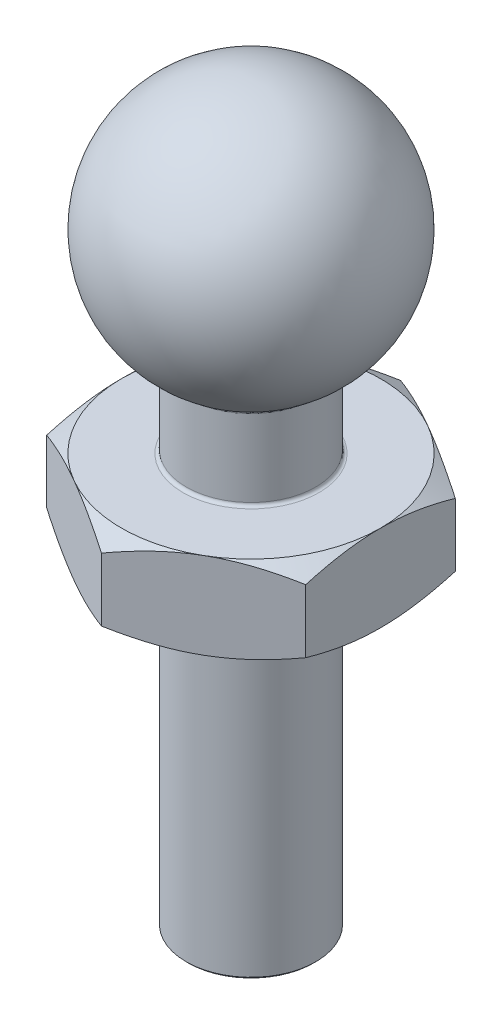
ISO-10303-21;
HEADER;
FILE_DESCRIPTION(('STEP AP214'),'2;1');
FILE_NAME('part.step','',(''),(''),'','','');
FILE_SCHEMA(('AUTOMOTIVE_DESIGN { 1 0 10303 214 1 1 1 1 }'));
ENDSEC;
DATA;
#1=APPLICATION_CONTEXT('core data for automotive mechanical design processes');
#2=APPLICATION_PROTOCOL_DEFINITION('international standard','automotive_design',2000,#1);
#3=PRODUCT_CONTEXT('',#1,'mechanical');
#4=PRODUCT('Part','Part','',(#3));
#5=PRODUCT_RELATED_PRODUCT_CATEGORY('part','',(#4));
#6=PRODUCT_DEFINITION_FORMATION('','',#4);
#7=PRODUCT_DEFINITION_CONTEXT('part definition',#1,'design');
#8=PRODUCT_DEFINITION('design','',#6,#7);
#9=PRODUCT_DEFINITION_SHAPE('','',#8);
#10=(LENGTH_UNIT() NAMED_UNIT(*) SI_UNIT(.MILLI.,.METRE.));
#11=(NAMED_UNIT(*) PLANE_ANGLE_UNIT() SI_UNIT($,.RADIAN.));
#12=(NAMED_UNIT(*) SI_UNIT($,.STERADIAN.) SOLID_ANGLE_UNIT());
#13=UNCERTAINTY_MEASURE_WITH_UNIT(LENGTH_MEASURE(1.E-05),#10,'distance_accuracy_value','');
#14=(GEOMETRIC_REPRESENTATION_CONTEXT(3) GLOBAL_UNCERTAINTY_ASSIGNED_CONTEXT((#13)) GLOBAL_UNIT_ASSIGNED_CONTEXT((#10,
#11,#12)) REPRESENTATION_CONTEXT('',''));
#15=CARTESIAN_POINT('',(0.,0.,0.));
#16=DIRECTION('',(0.,0.,1.));
#17=DIRECTION('',(1.,0.,0.));
#18=AXIS2_PLACEMENT_3D('',#15,#16,#17);
#19=CARTESIAN_POINT('',(-3.,9.5,-1.73205080756888));
#20=DIRECTION('',(1.,0.,0.));
#21=DIRECTION('',(0.,0.,-1.));
#22=AXIS2_PLACEMENT_3D('',#19,#20,#21);
#23=PLANE('',#22);
#24=CARTESIAN_POINT('',(-3.,7.49669275597267,-5.73225080756888));
#25=CARTESIAN_POINT('',(-3.,7.56535762873894,-5.59799811373669));
#26=CARTESIAN_POINT('',(-3.,7.63362658074956,-5.46354106552017));
#27=CARTESIAN_POINT('',(-3.,7.7691751977503,-5.19412594711895));
#28=CARTESIAN_POINT('',(-3.,7.83645484167597,-5.05916786634262));
#29=CARTESIAN_POINT('',(-3.,7.96993872408742,-4.78843231789163));
#30=CARTESIAN_POINT('',(-3.,8.0361409223391,-4.65265384244874));
#31=CARTESIAN_POINT('',(-3.,8.16708055525372,-4.38038885038151));
#32=CARTESIAN_POINT('',(-3.,8.23181796851999,-4.24390232345014));
#33=CARTESIAN_POINT('',(-3.,8.36273075239076,-3.96310511366176));
#34=CARTESIAN_POINT('',(-3.,8.42881132731156,-3.81875010473635));
#35=CARTESIAN_POINT('',(-3.,8.55842928727965,-3.52890389215656));
#36=CARTESIAN_POINT('',(-3.,8.62196674541402,-3.38341272129836));
#37=CARTESIAN_POINT('',(-3.,8.74573518476893,-3.0911428032025));
#38=CARTESIAN_POINT('',(-3.,8.80596844827942,-2.94436502804428));
#39=CARTESIAN_POINT('',(-3.,8.92221294586851,-2.64909731827644));
#40=CARTESIAN_POINT('',(-3.,8.97822314680859,-2.50060697487877));
#41=CARTESIAN_POINT('',(-3.,9.09420348606466,-2.17495473766773));
#42=CARTESIAN_POINT('',(-3.,9.15309774811247,-1.99740334689548));
#43=CARTESIAN_POINT('',(-3.,9.26029523419006,-1.63917764376158));
#44=CARTESIAN_POINT('',(-3.,9.30860404614459,-1.45850503366086));
#45=CARTESIAN_POINT('',(-3.,9.39023263279609,-1.09720914532956));
#46=CARTESIAN_POINT('',(-3.,9.42381477693698,-0.916647599895753));
#47=CARTESIAN_POINT('',(-3.,9.46126742176692,-0.644079261802783));
#48=CARTESIAN_POINT('',(-3.,9.47159787377878,-0.55294342286709));
#49=CARTESIAN_POINT('',(-3.,9.48763454600052,-0.370270654947723));
#50=CARTESIAN_POINT('',(-3.,9.49334144079801,-0.278733786435305));
#51=CARTESIAN_POINT('',(-3.,9.49996614854262,-0.0944078517722047));
#52=CARTESIAN_POINT('',(-3.,9.5008268616344,-0.00161671746075645));
#53=CARTESIAN_POINT('',(-3.,9.49757525562797,0.183877598413804));
#54=CARTESIAN_POINT('',(-3.,9.49346292019229,0.276580779686972));
#55=CARTESIAN_POINT('',(-3.,9.48041370767168,0.461668088480518));
#56=CARTESIAN_POINT('',(-3.,9.47147558711607,0.554052127589446));
#57=CARTESIAN_POINT('',(-3.,9.4490819835307,0.738276464049777));
#58=CARTESIAN_POINT('',(-3.,9.43562578745625,0.830116673244046));
#59=CARTESIAN_POINT('',(-3.,9.38848678345653,1.1081241349506));
#60=CARTESIAN_POINT('',(-3.,9.34831083516922,1.2932028927465));
#61=CARTESIAN_POINT('',(-3.,9.25483304091392,1.65992833453579));
#62=CARTESIAN_POINT('',(-3.,9.2015281748169,1.8415742184766));
#63=CARTESIAN_POINT('',(-3.,9.09001482170302,2.18718321983853));
#64=CARTESIAN_POINT('',(-3.,9.03254960886738,2.35139002090274));
#65=CARTESIAN_POINT('',(-3.,8.91157770593576,2.67757637701536));
#66=CARTESIAN_POINT('',(-3.,8.84806982210383,2.83955548471668));
#67=CARTESIAN_POINT('',(-3.,8.71649668995848,3.16180541641892));
#68=CARTESIAN_POINT('',(-3.,8.64842746398322,3.32207460435457));
#69=CARTESIAN_POINT('',(-3.,8.50888164672136,3.64112437712565));
#70=CARTESIAN_POINT('',(-3.,8.43740489080743,3.79990488959462));
#71=CARTESIAN_POINT('',(-3.,8.29572041514807,4.10783154121877));
#72=CARTESIAN_POINT('',(-3.,8.22564804300012,4.25704019529893));
#73=CARTESIAN_POINT('',(-3.,8.0836551872923,4.55457880885657));
#74=CARTESIAN_POINT('',(-3.,8.01173465191385,4.70290874355283));
#75=CARTESIAN_POINT('',(-3.,7.86663085724281,4.99841900754648));
#76=CARTESIAN_POINT('',(-3.,7.79345182235509,5.14560141584992));
#77=CARTESIAN_POINT('',(-3.,7.64590152942626,5.43935321353677));
#78=CARTESIAN_POINT('',(-3.,7.57153036655204,5.58592265068707));
#79=CARTESIAN_POINT('',(-3.,7.49669275597267,5.73225080756888));
#80=B_SPLINE_CURVE_WITH_KNOTS('',3,(#24,#25,#26,#27,#28,#29,#30,#31,#32,#33,#34,#35,#36,#37,#38,
#39,#40,#41,#42,#43,#44,#45,#46,#47,#48,#49,#50,#51,#52,#53,#54,#55,#56,#57,#58,#59,#60,#61,#62,
#63,#64,#65,#66,#67,#68,#69,#70,#71,#72,#73,#74,#75,#76,#77,#78,#79),.UNSPECIFIED.,.F.,.F.,(4,2,
2,2,2,2,2,2,2,2,2,2,2,2,2,2,2,2,2,2,2,2,2,2,2,2,2,4),(0.,0.452382016001321,0.904773650265348,
1.35794045354517,1.81111387213612,2.2873771437625,2.76362671813267,3.23954308217786,
3.71557550010852,4.27652369616462,4.83717505756687,5.38738613645125,5.66244417939779,
5.937462083513,6.21571369559986,6.4939662218021,6.77229048018743,7.05065868449287,
7.61810965270507,8.18569127741243,8.70745206667821,9.2293161451901,9.75164138486645,
10.2739918851653,10.7685068932809,11.2630357817083,11.756143015984,12.2492110799155),.UNSPECIFIED.);
#81=CARTESIAN_POINT('',(-3.,9.23205080756888,-1.73205080756888));
#82=VERTEX_POINT('',#81);
#83=CARTESIAN_POINT('',(-3.,9.5,0.));
#84=VERTEX_POINT('',#83);
#85=EDGE_CURVE('E231',#82,#84,#80,.T.);
#86=ORIENTED_EDGE('',*,*,#85,.F.);
#87=DIRECTION('',(0.,-1.,0.));
#88=VECTOR('',#87,1.);
#89=CARTESIAN_POINT('',(-3.,9.5,-1.73205080756888));
#90=LINE('',#89,#88);
#91=CARTESIAN_POINT('',(-3.,7.7679491924311,-1.73205080756891));
#92=VERTEX_POINT('',#91);
#93=EDGE_CURVE('E177',#82,#92,#90,.T.);
#94=ORIENTED_EDGE('',*,*,#93,.T.);
#95=CARTESIAN_POINT('',(-3.,9.50330724402733,5.73225080756888));
#96=CARTESIAN_POINT('',(-3.,9.43464237126105,5.59799811373669));
#97=CARTESIAN_POINT('',(-3.,9.36637341925044,5.46354106552017));
#98=CARTESIAN_POINT('',(-3.,9.2308248022497,5.19412594711896));
#99=CARTESIAN_POINT('',(-3.,9.16354515832403,5.05916786634262));
#100=CARTESIAN_POINT('',(-3.,9.03006127591258,4.78843231789163));
#101=CARTESIAN_POINT('',(-3.,8.9638590776609,4.65265384244875));
#102=CARTESIAN_POINT('',(-3.,8.83291944474628,4.38038885038151));
#103=CARTESIAN_POINT('',(-3.,8.76818203148001,4.24390232345014));
#104=CARTESIAN_POINT('',(-3.,8.63726924760924,3.96310511366176));
#105=CARTESIAN_POINT('',(-3.,8.57118867268844,3.81875010473635));
#106=CARTESIAN_POINT('',(-3.,8.44157071272035,3.52890389215656));
#107=CARTESIAN_POINT('',(-3.,8.37803325458598,3.38341272129836));
#108=CARTESIAN_POINT('',(-3.,8.25426481523107,3.0911428032025));
#109=CARTESIAN_POINT('',(-3.,8.19403155172058,2.94436502804428));
#110=CARTESIAN_POINT('',(-3.,8.07778705413149,2.64909731827644));
#111=CARTESIAN_POINT('',(-3.,8.02177685319141,2.50060697487877));
#112=CARTESIAN_POINT('',(-3.,7.90579651393534,2.17495473766773));
#113=CARTESIAN_POINT('',(-3.,7.84690225188754,1.99740334689548));
#114=CARTESIAN_POINT('',(-3.,7.73970476580994,1.63917764376158));
#115=CARTESIAN_POINT('',(-3.,7.69139595385541,1.45850503366086));
#116=CARTESIAN_POINT('',(-3.,7.60976736720391,1.09720914532956));
#117=CARTESIAN_POINT('',(-3.,7.57618522306301,0.916647599895755));
#118=CARTESIAN_POINT('',(-3.,7.53873257823308,0.644079261802784));
#119=CARTESIAN_POINT('',(-3.,7.52840212622122,0.552943422867091));
#120=CARTESIAN_POINT('',(-3.,7.51236545399948,0.370270654947725));
#121=CARTESIAN_POINT('',(-3.,7.50665855920199,0.278733786435306));
#122=CARTESIAN_POINT('',(-3.,7.50003385145738,0.094407851772205));
#123=CARTESIAN_POINT('',(-3.,7.4991731383656,0.00161671746075656));
#124=CARTESIAN_POINT('',(-3.,7.50242474437203,-0.183877598413804));
#125=CARTESIAN_POINT('',(-3.,7.50653707980771,-0.276580779686972));
#126=CARTESIAN_POINT('',(-3.,7.51958629232832,-0.461668088480519));
#127=CARTESIAN_POINT('',(-3.,7.52852441288393,-0.554052127589447));
#128=CARTESIAN_POINT('',(-3.,7.55091801646931,-0.738276464049778));
#129=CARTESIAN_POINT('',(-3.,7.56437421254375,-0.830116673244047));
#130=CARTESIAN_POINT('',(-3.,7.61151321654347,-1.1081241349506));
#131=CARTESIAN_POINT('',(-3.,7.65168916483078,-1.2932028927465));
#132=CARTESIAN_POINT('',(-3.,7.74516695908608,-1.65992833453579));
#133=CARTESIAN_POINT('',(-3.,7.79847182518309,-1.84157421847661));
#134=CARTESIAN_POINT('',(-3.,7.90998517829698,-2.18718321983853));
#135=CARTESIAN_POINT('',(-3.,7.96745039113262,-2.35139002090274));
#136=CARTESIAN_POINT('',(-3.,8.08842229406424,-2.67757637701536));
#137=CARTESIAN_POINT('',(-3.,8.15193017789617,-2.83955548471668));
#138=CARTESIAN_POINT('',(-3.,8.28350331004152,-3.16180541641892));
#139=CARTESIAN_POINT('',(-3.,8.35157253601678,-3.32207460435457));
#140=CARTESIAN_POINT('',(-3.,8.49111835327863,-3.64112437712565));
#141=CARTESIAN_POINT('',(-3.,8.56259510919257,-3.79990488959462));
#142=CARTESIAN_POINT('',(-3.,8.70427958485193,-4.10783154121876));
#143=CARTESIAN_POINT('',(-3.,8.77435195699987,-4.25704019529893));
#144=CARTESIAN_POINT('',(-3.,8.9163448127077,-4.55457880885657));
#145=CARTESIAN_POINT('',(-3.,8.98826534808615,-4.70290874355283));
#146=CARTESIAN_POINT('',(-3.,9.13336914275719,-4.99841900754647));
#147=CARTESIAN_POINT('',(-3.,9.20654817764491,-5.14560141584992));
#148=CARTESIAN_POINT('',(-3.,9.35409847057374,-5.43935321353677));
#149=CARTESIAN_POINT('',(-3.,9.42846963344796,-5.58592265068707));
#150=CARTESIAN_POINT('',(-3.,9.50330724402733,-5.73225080756888));
#151=B_SPLINE_CURVE_WITH_KNOTS('',3,(#95,#96,#97,#98,#99,#100,#101,#102,#103,#104,#105,#106,
#107,#108,#109,#110,#111,#112,#113,#114,#115,#116,#117,#118,#119,#120,#121,#122,#123,#124,#125,
#126,#127,#128,#129,#130,#131,#132,#133,#134,#135,#136,#137,#138,#139,#140,#141,#142,#143,#144,
#145,#146,#147,#148,#149,#150),.UNSPECIFIED.,.F.,.F.,(4,2,2,2,2,2,2,2,2,2,2,2,2,2,2,2,2,2,2,2,2,
2,2,2,2,2,2,4),(0.,0.452382016001322,0.90477365026535,1.35794045354517,1.81111387213612,
2.2873771437625,2.76362671813268,3.23954308217786,3.71557550010852,4.27652369616462,
4.83717505756687,5.38738613645125,5.66244417939779,5.93746208351301,6.21571369559987,
6.4939662218021,6.77229048018743,7.05065868449288,7.61810965270508,8.18569127741244,
8.70745206667822,9.2293161451901,9.75164138486645,10.2739918851653,10.7685068932809,
11.2630357817083,11.756143015984,12.2492110799155),.UNSPECIFIED.);
#152=CARTESIAN_POINT('',(-3.,7.5,0.));
#153=VERTEX_POINT('',#152);
#154=EDGE_CURVE('E238',#153,#92,#151,.T.);
#155=ORIENTED_EDGE('',*,*,#154,.F.);
#156=CARTESIAN_POINT('',(-3.,7.76794919243112,1.73205080756888));
#157=VERTEX_POINT('',#156);
#158=EDGE_CURVE('E245',#157,#153,#151,.T.);
#159=ORIENTED_EDGE('',*,*,#158,.F.);
#160=DIRECTION('',(0.,-1.,0.));
#161=VECTOR('',#160,1.);
#162=CARTESIAN_POINT('',(-3.,9.5,1.73205080756888));
#163=LINE('',#162,#161);
#164=CARTESIAN_POINT('',(-3.,9.23205080756888,1.73205080756888));
#165=VERTEX_POINT('',#164);
#166=EDGE_CURVE('E264',#165,#157,#163,.T.);
#167=ORIENTED_EDGE('',*,*,#166,.F.);
#168=EDGE_CURVE('E162',#84,#165,#80,.T.);
#169=ORIENTED_EDGE('',*,*,#168,.F.);
#170=EDGE_LOOP('',(#86,#94,#155,#159,#167,#169));
#171=FACE_BOUND('',#170,.T.);
#172=ADVANCED_FACE('F39',(#171),#23,.F.);
#173=CARTESIAN_POINT('',(0.,9.5,-3.46410161513776));
#174=DIRECTION('',(0.5,0.,0.866025403784438));
#175=DIRECTION('',(0.866025403784438,0.,-0.5));
#176=AXIS2_PLACEMENT_3D('',#173,#174,#175);
#177=PLANE('',#176);
#178=CARTESIAN_POINT('',(0.00019999999999956,9.23198413756899,-3.46421708519159));
#179=CARTESIAN_POINT('',(-0.131635206588332,9.27594629554769,-3.38810199317915));
#180=CARTESIAN_POINT('',(-0.26460840535525,9.31592841370737,-3.31132988107606));
#181=CARTESIAN_POINT('',(-0.532857420002056,9.38571791955454,-3.15645624025988));
#182=CARTESIAN_POINT('',(-0.668138002634342,9.41550061773462,-3.078351959461));
#183=CARTESIAN_POINT('',(-0.937022602096483,9.46186216078874,-2.92311136358059));
#184=CARTESIAN_POINT('',(-1.07058524542946,9.47874955887705,-2.84599893549861));
#185=CARTESIAN_POINT('',(-1.33833905729569,9.49891035755148,-2.6914112001411));
#186=CARTESIAN_POINT('',(-1.47252925247984,9.50220045221892,-2.61393645482892));
#187=CARTESIAN_POINT('',(-1.72327559769581,9.49535946911461,-2.46916798492017));
#188=CARTESIAN_POINT('',(-1.83986926497268,9.48690808580738,-2.40185259973206));
#189=CARTESIAN_POINT('',(-2.07229698497464,9.46012105699297,-2.2676603930218));
#190=CARTESIAN_POINT('',(-2.18813023365133,9.44177625913829,-2.2007840357172));
#191=CARTESIAN_POINT('',(-2.42103725705637,9.39591524914667,-2.06631510305815));
#192=CARTESIAN_POINT('',(-2.53808155051394,9.36820461473692,-1.99873954872331));
#193=CARTESIAN_POINT('',(-2.77042435049913,9.3053122048626,-1.86459637060759));
#194=CARTESIAN_POINT('',(-2.88572583417111,9.27014520897844,-1.79802702797161));
#195=CARTESIAN_POINT('',(-3.0002,9.23198413756899,-1.73193533751504));
#196=B_SPLINE_CURVE_WITH_KNOTS('',3,(#178,#179,#180,#181,#182,#183,#184,#185,#186,#187,#188,
#189,#190,#191,#192,#193,#194,#195),.UNSPECIFIED.,.F.,.F.,(4,2,2,2,2,2,2,2,4),(0.,
0.475539830103041,0.952222784107964,1.41710776961288,1.88142182298026,2.28572436316091,
2.69040156475039,3.10405572063576,3.5168974940707),.UNSPECIFIED.);
#197=CARTESIAN_POINT('',(0.,9.23205080756888,-3.46410161513776));
#198=VERTEX_POINT('',#197);
#199=CARTESIAN_POINT('',(-1.5,9.5,-2.59807621135332));
#200=VERTEX_POINT('',#199);
#201=EDGE_CURVE('E157',#198,#200,#196,.T.);
#202=ORIENTED_EDGE('',*,*,#201,.F.);
#203=DIRECTION('',(0.,-1.,0.));
#204=VECTOR('',#203,1.);
#205=CARTESIAN_POINT('',(0.,9.5,-3.46410161513776));
#206=LINE('',#205,#204);
#207=CARTESIAN_POINT('',(0.,7.76794919243112,-3.46410161513776));
#208=VERTEX_POINT('',#207);
#209=EDGE_CURVE('E261',#198,#208,#206,.T.);
#210=ORIENTED_EDGE('',*,*,#209,.T.);
#211=CARTESIAN_POINT('',(-3.0002,7.76801586243101,-1.73193533751504));
#212=CARTESIAN_POINT('',(-2.86836479341167,7.72405370445231,-1.80805042952748));
#213=CARTESIAN_POINT('',(-2.73539159464475,7.68407158629263,-1.88482254163057));
#214=CARTESIAN_POINT('',(-2.46714257999795,7.61428208044547,-2.03969618244675));
#215=CARTESIAN_POINT('',(-2.33186199736566,7.58449938226538,-2.11780046324563));
#216=CARTESIAN_POINT('',(-2.06297739790352,7.53813783921126,-2.27304105912604));
#217=CARTESIAN_POINT('',(-1.92941475457054,7.52125044112295,-2.35015348720802));
#218=CARTESIAN_POINT('',(-1.66166094270431,7.50108964244852,-2.50474122256553));
#219=CARTESIAN_POINT('',(-1.52747074752016,7.49779954778108,-2.58221596787771));
#220=CARTESIAN_POINT('',(-1.2767244023042,7.50464053088539,-2.72698443778646));
#221=CARTESIAN_POINT('',(-1.16013073502733,7.51309191419262,-2.79429982297457));
#222=CARTESIAN_POINT('',(-0.927703015025366,7.53987894300703,-2.92849202968483));
#223=CARTESIAN_POINT('',(-0.811869766348671,7.55822374086171,-2.99536838698943));
#224=CARTESIAN_POINT('',(-0.578962742943634,7.60408475085333,-3.12983731964848));
#225=CARTESIAN_POINT('',(-0.461918449486061,7.63179538526308,-3.19741287398332));
#226=CARTESIAN_POINT('',(-0.229575649500876,7.6946877951374,-3.33155605209904));
#227=CARTESIAN_POINT('',(-0.114274165828895,7.72985479102156,-3.39812539473502));
#228=CARTESIAN_POINT('',(0.000199999999999272,7.76801586243101,-3.46421708519159));
#229=B_SPLINE_CURVE_WITH_KNOTS('',3,(#211,#212,#213,#214,#215,#216,#217,#218,#219,#220,#221,
#222,#223,#224,#225,#226,#227,#228),.UNSPECIFIED.,.F.,.F.,(4,2,2,2,2,2,2,2,4),(0.,
0.47553983010304,0.952222784107964,1.41710776961288,1.88142182298026,2.28572436316091,
2.69040156475039,3.10405572063576,3.5168974940707),.UNSPECIFIED.);
#230=CARTESIAN_POINT('',(-1.5,7.5,-2.59807621135332));
#231=VERTEX_POINT('',#230);
#232=EDGE_CURVE('E319',#231,#208,#229,.T.);
#233=ORIENTED_EDGE('',*,*,#232,.F.);
#234=EDGE_CURVE('E308',#92,#231,#229,.T.);
#235=ORIENTED_EDGE('',*,*,#234,.F.);
#236=ORIENTED_EDGE('',*,*,#93,.F.);
#237=EDGE_CURVE('E150',#200,#82,#196,.T.);
#238=ORIENTED_EDGE('',*,*,#237,.F.);
#239=EDGE_LOOP('',(#202,#210,#233,#235,#236,#238));
#240=FACE_BOUND('',#239,.T.);
#241=ADVANCED_FACE('F175',(#240),#177,.F.);
#242=CARTESIAN_POINT('',(3.,9.5,-1.73205080756888));
#243=DIRECTION('',(-0.5,0.,0.866025403784439));
#244=DIRECTION('',(0.866025403784439,0.,0.5));
#245=AXIS2_PLACEMENT_3D('',#242,#243,#244);
#246=PLANE('',#245);
#247=CARTESIAN_POINT('',(3.0002,9.23198413756899,-1.73193533751504));
#248=CARTESIAN_POINT('',(2.86836479341167,9.27594629554769,-1.80805042952748));
#249=CARTESIAN_POINT('',(2.73539159464475,9.31592841370737,-1.88482254163057));
#250=CARTESIAN_POINT('',(2.46714257999794,9.38571791955454,-2.03969618244676));
#251=CARTESIAN_POINT('',(2.33186199736566,9.41550061773462,-2.11780046324564));
#252=CARTESIAN_POINT('',(2.06297739790352,9.46186216078874,-2.27304105912605));
#253=CARTESIAN_POINT('',(1.92941475457054,9.47874955887705,-2.35015348720802));
#254=CARTESIAN_POINT('',(1.66166094270431,9.49891035755148,-2.50474122256554));
#255=CARTESIAN_POINT('',(1.52747074752015,9.50220045221892,-2.58221596787772));
#256=CARTESIAN_POINT('',(1.27672440230419,9.49535946911461,-2.72698443778647));
#257=CARTESIAN_POINT('',(1.16013073502732,9.48690808580738,-2.79429982297457));
#258=CARTESIAN_POINT('',(0.927703015025362,9.46012105699296,-2.92849202968484));
#259=CARTESIAN_POINT('',(0.811869766348667,9.44177625913829,-2.99536838698943));
#260=CARTESIAN_POINT('',(0.578962742943631,9.39591524914667,-3.12983731964849));
#261=CARTESIAN_POINT('',(0.461918449486058,9.36820461473692,-3.19741287398333));
#262=CARTESIAN_POINT('',(0.229575649500874,9.3053122048626,-3.33155605209904));
#263=CARTESIAN_POINT('',(0.114274165828893,9.27014520897844,-3.39812539473502));
#264=CARTESIAN_POINT('',(-0.000200000000000704,9.23198413756899,-3.46421708519159));
#265=B_SPLINE_CURVE_WITH_KNOTS('',3,(#247,#248,#249,#250,#251,#252,#253,#254,#255,#256,#257,
#258,#259,#260,#261,#262,#263,#264),.UNSPECIFIED.,.F.,.F.,(4,2,2,2,2,2,2,2,4),(0.,
0.475539830103041,0.952222784107964,1.41710776961288,1.88142182298026,2.28572436316091,
2.69040156475039,3.10405572063576,3.5168974940707),.UNSPECIFIED.);
#266=CARTESIAN_POINT('',(3.,9.2320508075689,-1.73205080756891));
#267=VERTEX_POINT('',#266);
#268=CARTESIAN_POINT('',(1.5,9.5,-2.59807621135332));
#269=VERTEX_POINT('',#268);
#270=EDGE_CURVE('E133',#267,#269,#265,.T.);
#271=ORIENTED_EDGE('',*,*,#270,.F.);
#272=DIRECTION('',(0.,-1.,0.));
#273=VECTOR('',#272,1.);
#274=CARTESIAN_POINT('',(3.,9.5,-1.73205080756888));
#275=LINE('',#274,#273);
#276=CARTESIAN_POINT('',(3.,7.76794919243112,-1.73205080756888));
#277=VERTEX_POINT('',#276);
#278=EDGE_CURVE('E155',#267,#277,#275,.T.);
#279=ORIENTED_EDGE('',*,*,#278,.T.);
#280=CARTESIAN_POINT('',(-0.00020000000000044,7.76801586243101,-3.46421708519159));
#281=CARTESIAN_POINT('',(0.131635206588331,7.72405370445231,-3.38810199317915));
#282=CARTESIAN_POINT('',(0.264608405355249,7.68407158629263,-3.31132988107607));
#283=CARTESIAN_POINT('',(0.532857420002056,7.61428208044547,-3.15645624025988));
#284=CARTESIAN_POINT('',(0.668138002634341,7.58449938226538,-3.078351959461));
#285=CARTESIAN_POINT('',(0.937022602096483,7.53813783921126,-2.92311136358059));
#286=CARTESIAN_POINT('',(1.07058524542946,7.52125044112295,-2.84599893549862));
#287=CARTESIAN_POINT('',(1.33833905729569,7.50108964244852,-2.6914112001411));
#288=CARTESIAN_POINT('',(1.47252925247984,7.49779954778108,-2.61393645482892));
#289=CARTESIAN_POINT('',(1.72327559769581,7.50464053088539,-2.46916798492017));
#290=CARTESIAN_POINT('',(1.83986926497268,7.51309191419262,-2.40185259973206));
#291=CARTESIAN_POINT('',(2.07229698497464,7.53987894300703,-2.2676603930218));
#292=CARTESIAN_POINT('',(2.18813023365133,7.55822374086171,-2.2007840357172));
#293=CARTESIAN_POINT('',(2.42103725705637,7.60408475085333,-2.06631510305815));
#294=CARTESIAN_POINT('',(2.53808155051394,7.63179538526308,-1.99873954872331));
#295=CARTESIAN_POINT('',(2.77042435049912,7.6946877951374,-1.86459637060759));
#296=CARTESIAN_POINT('',(2.8857258341711,7.72985479102156,-1.79802702797161));
#297=CARTESIAN_POINT('',(3.0002,7.76801586243101,-1.73193533751504));
#298=B_SPLINE_CURVE_WITH_KNOTS('',3,(#280,#281,#282,#283,#284,#285,#286,#287,#288,#289,#290,
#291,#292,#293,#294,#295,#296,#297),.UNSPECIFIED.,.F.,.F.,(4,2,2,2,2,2,2,2,4),(0.,
0.475539830103041,0.952222784107964,1.41710776961288,1.88142182298026,2.28572436316091,
2.69040156475039,3.10405572063576,3.5168974940707),.UNSPECIFIED.);
#299=CARTESIAN_POINT('',(1.5,7.5,-2.59807621135332));
#300=VERTEX_POINT('',#299);
#301=EDGE_CURVE('E274',#300,#277,#298,.T.);
#302=ORIENTED_EDGE('',*,*,#301,.F.);
#303=EDGE_CURVE('E313',#208,#300,#298,.T.);
#304=ORIENTED_EDGE('',*,*,#303,.F.);
#305=ORIENTED_EDGE('',*,*,#209,.F.);
#306=EDGE_CURVE('E156',#269,#198,#265,.T.);
#307=ORIENTED_EDGE('',*,*,#306,.F.);
#308=EDGE_LOOP('',(#271,#279,#302,#304,#305,#307));
#309=FACE_BOUND('',#308,.T.);
#310=ADVANCED_FACE('F284',(#309),#246,.F.);
#311=CARTESIAN_POINT('',(3.,9.5,1.73205080756888));
#312=DIRECTION('',(-1.,0.,0.));
#313=DIRECTION('',(0.,0.,1.));
#314=AXIS2_PLACEMENT_3D('',#311,#312,#313);
#315=PLANE('',#314);
#316=CARTESIAN_POINT('',(3.,7.49669275597267,5.73225080756888));
#317=CARTESIAN_POINT('',(3.,7.56535762873894,5.59799811373669));
#318=CARTESIAN_POINT('',(3.,7.63362658074956,5.46354106552017));
#319=CARTESIAN_POINT('',(3.,7.7691751977503,5.19412594711896));
#320=CARTESIAN_POINT('',(3.,7.83645484167597,5.05916786634262));
#321=CARTESIAN_POINT('',(3.,7.96993872408742,4.78843231789163));
#322=CARTESIAN_POINT('',(3.,8.0361409223391,4.65265384244875));
#323=CARTESIAN_POINT('',(3.,8.16708055525372,4.38038885038151));
#324=CARTESIAN_POINT('',(3.,8.23181796851999,4.24390232345014));
#325=CARTESIAN_POINT('',(3.,8.36273075239076,3.96310511366176));
#326=CARTESIAN_POINT('',(3.,8.42881132731156,3.81875010473635));
#327=CARTESIAN_POINT('',(3.,8.55842928727965,3.52890389215656));
#328=CARTESIAN_POINT('',(3.,8.62196674541402,3.38341272129836));
#329=CARTESIAN_POINT('',(3.,8.74573518476893,3.0911428032025));
#330=CARTESIAN_POINT('',(3.,8.80596844827941,2.94436502804428));
#331=CARTESIAN_POINT('',(3.,8.92221294586851,2.64909731827644));
#332=CARTESIAN_POINT('',(3.,8.97822314680859,2.50060697487877));
#333=CARTESIAN_POINT('',(3.,9.09420348606466,2.17495473766773));
#334=CARTESIAN_POINT('',(3.,9.15309774811246,1.99740334689548));
#335=CARTESIAN_POINT('',(3.,9.26029523419006,1.63917764376158));
#336=CARTESIAN_POINT('',(3.,9.30860404614459,1.45850503366086));
#337=CARTESIAN_POINT('',(3.,9.39023263279609,1.09720914532956));
#338=CARTESIAN_POINT('',(3.,9.42381477693698,0.916647599895757));
#339=CARTESIAN_POINT('',(3.,9.46126742176692,0.644079261802787));
#340=CARTESIAN_POINT('',(3.,9.47159787377878,0.552943422867095));
#341=CARTESIAN_POINT('',(3.,9.48763454600052,0.370270654947728));
#342=CARTESIAN_POINT('',(3.,9.49334144079801,0.278733786435309));
#343=CARTESIAN_POINT('',(3.,9.49996614854262,0.0944078517722085));
#344=CARTESIAN_POINT('',(3.,9.5008268616344,0.00161671746076017));
#345=CARTESIAN_POINT('',(3.,9.49757525562797,-0.1838775984138));
#346=CARTESIAN_POINT('',(3.,9.49346292019229,-0.276580779686968));
#347=CARTESIAN_POINT('',(3.,9.48041370767168,-0.461668088480514));
#348=CARTESIAN_POINT('',(3.,9.47147558711607,-0.554052127589442));
#349=CARTESIAN_POINT('',(3.,9.4490819835307,-0.738276464049773));
#350=CARTESIAN_POINT('',(3.,9.43562578745626,-0.830116673244043));
#351=CARTESIAN_POINT('',(3.,9.38848678345653,-1.1081241349506));
#352=CARTESIAN_POINT('',(3.,9.34831083516922,-1.29320289274649));
#353=CARTESIAN_POINT('',(3.,9.25483304091392,-1.65992833453579));
#354=CARTESIAN_POINT('',(3.,9.20152817481691,-1.8415742184766));
#355=CARTESIAN_POINT('',(3.,9.09001482170302,-2.18718321983853));
#356=CARTESIAN_POINT('',(3.,9.03254960886738,-2.35139002090274));
#357=CARTESIAN_POINT('',(3.,8.91157770593577,-2.67757637701536));
#358=CARTESIAN_POINT('',(3.,8.84806982210383,-2.83955548471668));
#359=CARTESIAN_POINT('',(3.,8.71649668995848,-3.16180541641892));
#360=CARTESIAN_POINT('',(3.,8.64842746398322,-3.32207460435457));
#361=CARTESIAN_POINT('',(3.,8.50888164672137,-3.64112437712565));
#362=CARTESIAN_POINT('',(3.,8.43740489080743,-3.79990488959462));
#363=CARTESIAN_POINT('',(3.,8.29572041514807,-4.10783154121877));
#364=CARTESIAN_POINT('',(3.,8.22564804300012,-4.25704019529893));
#365=CARTESIAN_POINT('',(3.,8.0836551872923,-4.55457880885657));
#366=CARTESIAN_POINT('',(3.,8.01173465191384,-4.70290874355283));
#367=CARTESIAN_POINT('',(3.,7.86663085724281,-4.99841900754648));
#368=CARTESIAN_POINT('',(3.,7.79345182235509,-5.14560141584992));
#369=CARTESIAN_POINT('',(3.,7.64590152942626,-5.43935321353678));
#370=CARTESIAN_POINT('',(3.,7.57153036655204,-5.58592265068707));
#371=CARTESIAN_POINT('',(3.,7.49669275597267,-5.73225080756888));
#372=B_SPLINE_CURVE_WITH_KNOTS('',3,(#316,#317,#318,#319,#320,#321,#322,#323,#324,#325,#326,
#327,#328,#329,#330,#331,#332,#333,#334,#335,#336,#337,#338,#339,#340,#341,#342,#343,#344,#345,
#346,#347,#348,#349,#350,#351,#352,#353,#354,#355,#356,#357,#358,#359,#360,#361,#362,#363,#364,
#365,#366,#367,#368,#369,#370,#371),.UNSPECIFIED.,.F.,.F.,(4,2,2,2,2,2,2,2,2,2,2,2,2,2,2,2,2,2,
2,2,2,2,2,2,2,2,2,4),(0.,0.452382016001322,0.904773650265348,1.35794045354517,1.81111387213612,
2.2873771437625,2.76362671813268,3.23954308217786,3.71557550010852,4.27652369616462,
4.83717505756687,5.38738613645124,5.66244417939779,5.937462083513,6.21571369559986,
6.4939662218021,6.77229048018743,7.05065868449287,7.61810965270507,8.18569127741243,
8.70745206667822,9.2293161451901,9.75164138486646,10.2739918851653,10.7685068932809,
11.2630357817083,11.756143015984,12.2492110799155),.UNSPECIFIED.);
#373=CARTESIAN_POINT('',(3.,9.23205080756888,1.73205080756888));
#374=VERTEX_POINT('',#373);
#375=CARTESIAN_POINT('',(3.,9.5,0.));
#376=VERTEX_POINT('',#375);
#377=EDGE_CURVE('E144',#374,#376,#372,.T.);
#378=ORIENTED_EDGE('',*,*,#377,.F.);
#379=DIRECTION('',(0.,-1.,0.));
#380=VECTOR('',#379,1.);
#381=CARTESIAN_POINT('',(3.,9.5,1.73205080756888));
#382=LINE('',#381,#380);
#383=CARTESIAN_POINT('',(3.,7.76794919243112,1.73205080756888));
#384=VERTEX_POINT('',#383);
#385=EDGE_CURVE('E258',#374,#384,#382,.T.);
#386=ORIENTED_EDGE('',*,*,#385,.T.);
#387=CARTESIAN_POINT('',(3.,9.50330724402733,-5.73225080756888));
#388=CARTESIAN_POINT('',(3.,9.43464237126105,-5.59799811373669));
#389=CARTESIAN_POINT('',(3.,9.36637341925044,-5.46354106552018));
#390=CARTESIAN_POINT('',(3.,9.2308248022497,-5.19412594711896));
#391=CARTESIAN_POINT('',(3.,9.16354515832403,-5.05916786634262));
#392=CARTESIAN_POINT('',(3.,9.03006127591258,-4.78843231789163));
#393=CARTESIAN_POINT('',(3.,8.9638590776609,-4.65265384244875));
#394=CARTESIAN_POINT('',(3.,8.83291944474628,-4.38038885038152));
#395=CARTESIAN_POINT('',(3.,8.76818203148001,-4.24390232345015));
#396=CARTESIAN_POINT('',(3.,8.63726924760924,-3.96310511366176));
#397=CARTESIAN_POINT('',(3.,8.57118867268844,-3.81875010473635));
#398=CARTESIAN_POINT('',(3.,8.44157071272035,-3.52890389215656));
#399=CARTESIAN_POINT('',(3.,8.37803325458598,-3.38341272129836));
#400=CARTESIAN_POINT('',(3.,8.25426481523107,-3.0911428032025));
#401=CARTESIAN_POINT('',(3.,8.19403155172058,-2.94436502804428));
#402=CARTESIAN_POINT('',(3.,8.07778705413149,-2.64909731827644));
#403=CARTESIAN_POINT('',(3.,8.02177685319141,-2.50060697487877));
#404=CARTESIAN_POINT('',(3.,7.90579651393534,-2.17495473766774));
#405=CARTESIAN_POINT('',(3.,7.84690225188754,-1.99740334689548));
#406=CARTESIAN_POINT('',(3.,7.73970476580994,-1.63917764376158));
#407=CARTESIAN_POINT('',(3.,7.69139595385541,-1.45850503366086));
#408=CARTESIAN_POINT('',(3.,7.60976736720391,-1.09720914532956));
#409=CARTESIAN_POINT('',(3.,7.57618522306302,-0.916647599895758));
#410=CARTESIAN_POINT('',(3.,7.53873257823308,-0.644079261802788));
#411=CARTESIAN_POINT('',(3.,7.52840212622122,-0.552943422867095));
#412=CARTESIAN_POINT('',(3.,7.51236545399948,-0.370270654947728));
#413=CARTESIAN_POINT('',(3.,7.50665855920199,-0.27873378643531));
#414=CARTESIAN_POINT('',(3.,7.50003385145738,-0.0944078517722087));
#415=CARTESIAN_POINT('',(3.,7.4991731383656,-0.00161671746076019));
#416=CARTESIAN_POINT('',(3.,7.50242474437203,0.183877598413801));
#417=CARTESIAN_POINT('',(3.,7.50653707980771,0.276580779686968));
#418=CARTESIAN_POINT('',(3.,7.51958629232832,0.461668088480515));
#419=CARTESIAN_POINT('',(3.,7.52852441288393,0.554052127589443));
#420=CARTESIAN_POINT('',(3.,7.5509180164693,0.738276464049774));
#421=CARTESIAN_POINT('',(3.,7.56437421254374,0.830116673244044));
#422=CARTESIAN_POINT('',(3.,7.61151321654347,1.1081241349506));
#423=CARTESIAN_POINT('',(3.,7.65168916483078,1.29320289274649));
#424=CARTESIAN_POINT('',(3.,7.74516695908608,1.65992833453579));
#425=CARTESIAN_POINT('',(3.,7.79847182518309,1.8415742184766));
#426=CARTESIAN_POINT('',(3.,7.90998517829698,2.18718321983853));
#427=CARTESIAN_POINT('',(3.,7.96745039113261,2.35139002090273));
#428=CARTESIAN_POINT('',(3.,8.08842229406423,2.67757637701535));
#429=CARTESIAN_POINT('',(3.,8.15193017789617,2.83955548471668));
#430=CARTESIAN_POINT('',(3.,8.28350331004152,3.16180541641892));
#431=CARTESIAN_POINT('',(3.,8.35157253601677,3.32207460435457));
#432=CARTESIAN_POINT('',(3.,8.49111835327863,3.64112437712565));
#433=CARTESIAN_POINT('',(3.,8.56259510919257,3.79990488959461));
#434=CARTESIAN_POINT('',(3.,8.70427958485193,4.10783154121876));
#435=CARTESIAN_POINT('',(3.,8.77435195699987,4.25704019529893));
#436=CARTESIAN_POINT('',(3.,8.9163448127077,4.55457880885657));
#437=CARTESIAN_POINT('',(3.,8.98826534808615,4.70290874355283));
#438=CARTESIAN_POINT('',(3.,9.13336914275719,4.99841900754647));
#439=CARTESIAN_POINT('',(3.,9.20654817764491,5.14560141584992));
#440=CARTESIAN_POINT('',(3.,9.35409847057374,5.43935321353677));
#441=CARTESIAN_POINT('',(3.,9.42846963344796,5.58592265068707));
#442=CARTESIAN_POINT('',(3.,9.50330724402733,5.73225080756888));
#443=B_SPLINE_CURVE_WITH_KNOTS('',3,(#387,#388,#389,#390,#391,#392,#393,#394,#395,#396,#397,
#398,#399,#400,#401,#402,#403,#404,#405,#406,#407,#408,#409,#410,#411,#412,#413,#414,#415,#416,
#417,#418,#419,#420,#421,#422,#423,#424,#425,#426,#427,#428,#429,#430,#431,#432,#433,#434,#435,
#436,#437,#438,#439,#440,#441,#442),.UNSPECIFIED.,.F.,.F.,(4,2,2,2,2,2,2,2,2,2,2,2,2,2,2,2,2,2,
2,2,2,2,2,2,2,2,2,4),(0.,0.452382016001322,0.90477365026535,1.35794045354517,1.81111387213612,
2.2873771437625,2.76362671813268,3.23954308217786,3.71557550010852,4.27652369616462,
4.83717505756687,5.38738613645125,5.66244417939779,5.93746208351301,6.21571369559987,
6.49396622180211,6.77229048018743,7.05065868449288,7.61810965270508,8.18569127741244,
8.70745206667822,9.2293161451901,9.75164138486645,10.2739918851653,10.7685068932809,
11.2630357817083,11.756143015984,12.2492110799155),.UNSPECIFIED.);
#444=CARTESIAN_POINT('',(3.,7.5,0.));
#445=VERTEX_POINT('',#444);
#446=EDGE_CURVE('E267',#445,#384,#443,.T.);
#447=ORIENTED_EDGE('',*,*,#446,.F.);
#448=EDGE_CURVE('E266',#277,#445,#443,.T.);
#449=ORIENTED_EDGE('',*,*,#448,.F.);
#450=ORIENTED_EDGE('',*,*,#278,.F.);
#451=EDGE_CURVE('E131',#376,#267,#372,.T.);
#452=ORIENTED_EDGE('',*,*,#451,.F.);
#453=EDGE_LOOP('',(#378,#386,#447,#449,#450,#452));
#454=FACE_BOUND('',#453,.T.);
#455=ADVANCED_FACE('F153',(#454),#315,.F.);
#456=CARTESIAN_POINT('',(0.,9.5,3.46410161513775));
#457=DIRECTION('',(-0.5,0.,-0.866025403784439));
#458=DIRECTION('',(-0.866025403784439,0.,0.5));
#459=AXIS2_PLACEMENT_3D('',#456,#457,#458);
#460=PLANE('',#459);
#461=CARTESIAN_POINT('',(-0.000200000000000103,9.23198413756899,3.46421708519159));
#462=CARTESIAN_POINT('',(0.131635206588331,9.27594629554769,3.38810199317915));
#463=CARTESIAN_POINT('',(0.264608405355249,9.31592841370737,3.31132988107606));
#464=CARTESIAN_POINT('',(0.532857420002056,9.38571791955454,3.15645624025988));
#465=CARTESIAN_POINT('',(0.668138002634341,9.41550061773462,3.078351959461));
#466=CARTESIAN_POINT('',(0.937022602096483,9.46186216078874,2.92311136358059));
#467=CARTESIAN_POINT('',(1.07058524542946,9.47874955887705,2.84599893549861));
#468=CARTESIAN_POINT('',(1.33833905729569,9.49891035755148,2.6914112001411));
#469=CARTESIAN_POINT('',(1.47252925247984,9.50220045221892,2.61393645482892));
#470=CARTESIAN_POINT('',(1.72327559769581,9.49535946911461,2.46916798492017));
#471=CARTESIAN_POINT('',(1.83986926497268,9.48690808580738,2.40185259973206));
#472=CARTESIAN_POINT('',(2.07229698497464,9.46012105699297,2.2676603930218));
#473=CARTESIAN_POINT('',(2.18813023365133,9.44177625913829,2.2007840357172));
#474=CARTESIAN_POINT('',(2.42103725705637,9.39591524914667,2.06631510305815));
#475=CARTESIAN_POINT('',(2.53808155051394,9.36820461473692,1.99873954872331));
#476=CARTESIAN_POINT('',(2.77042435049912,9.3053122048626,1.86459637060759));
#477=CARTESIAN_POINT('',(2.88572583417111,9.27014520897844,1.79802702797161));
#478=CARTESIAN_POINT('',(3.0002,9.23198413756899,1.73193533751504));
#479=B_SPLINE_CURVE_WITH_KNOTS('',3,(#461,#462,#463,#464,#465,#466,#467,#468,#469,#470,#471,
#472,#473,#474,#475,#476,#477,#478),.UNSPECIFIED.,.F.,.F.,(4,2,2,2,2,2,2,2,4),(0.,
0.475539830103041,0.952222784107964,1.41710776961288,1.88142182298026,2.28572436316091,
2.69040156475039,3.10405572063576,3.5168974940707),.UNSPECIFIED.);
#480=CARTESIAN_POINT('',(0.,9.23205080756888,3.46410161513775));
#481=VERTEX_POINT('',#480);
#482=CARTESIAN_POINT('',(1.5,9.5,2.59807621135332));
#483=VERTEX_POINT('',#482);
#484=EDGE_CURVE('E160',#481,#483,#479,.T.);
#485=ORIENTED_EDGE('',*,*,#484,.F.);
#486=DIRECTION('',(0.,-1.,0.));
#487=VECTOR('',#486,1.);
#488=CARTESIAN_POINT('',(0.,9.5,3.46410161513775));
#489=LINE('',#488,#487);
#490=CARTESIAN_POINT('',(0.,7.76794919243112,3.46410161513775));
#491=VERTEX_POINT('',#490);
#492=EDGE_CURVE('E256',#481,#491,#489,.T.);
#493=ORIENTED_EDGE('',*,*,#492,.T.);
#494=CARTESIAN_POINT('',(3.0002,7.76801586243101,1.73193533751504));
#495=CARTESIAN_POINT('',(2.86836479341167,7.7240537044523,1.80805042952748));
#496=CARTESIAN_POINT('',(2.73539159464475,7.68407158629263,1.88482254163057));
#497=CARTESIAN_POINT('',(2.46714257999794,7.61428208044546,2.03969618244675));
#498=CARTESIAN_POINT('',(2.33186199736566,7.58449938226538,2.11780046324563));
#499=CARTESIAN_POINT('',(2.06297739790352,7.53813783921126,2.27304105912605));
#500=CARTESIAN_POINT('',(1.92941475457054,7.52125044112295,2.35015348720802));
#501=CARTESIAN_POINT('',(1.66166094270431,7.50108964244852,2.50474122256553));
#502=CARTESIAN_POINT('',(1.52747074752016,7.49779954778108,2.58221596787771));
#503=CARTESIAN_POINT('',(1.27672440230419,7.50464053088539,2.72698443778646));
#504=CARTESIAN_POINT('',(1.16013073502732,7.51309191419262,2.79429982297457));
#505=CARTESIAN_POINT('',(0.927703015025364,7.53987894300703,2.92849202968483));
#506=CARTESIAN_POINT('',(0.811869766348669,7.55822374086171,2.99536838698943));
#507=CARTESIAN_POINT('',(0.578962742943632,7.60408475085333,3.12983731964848));
#508=CARTESIAN_POINT('',(0.461918449486059,7.63179538526308,3.19741287398332));
#509=CARTESIAN_POINT('',(0.229575649500875,7.6946877951374,3.33155605209904));
#510=CARTESIAN_POINT('',(0.114274165828894,7.72985479102156,3.39812539473502));
#511=CARTESIAN_POINT('',(-0.000200000000000261,7.76801586243101,3.46421708519159));
#512=B_SPLINE_CURVE_WITH_KNOTS('',3,(#494,#495,#496,#497,#498,#499,#500,#501,#502,#503,#504,
#505,#506,#507,#508,#509,#510,#511),.UNSPECIFIED.,.F.,.F.,(4,2,2,2,2,2,2,2,4),(0.,
0.475539830103041,0.952222784107965,1.41710776961288,1.88142182298026,2.28572436316091,
2.69040156475039,3.10405572063576,3.5168974940707),.UNSPECIFIED.);
#513=CARTESIAN_POINT('',(1.5,7.5,2.59807621135332));
#514=VERTEX_POINT('',#513);
#515=EDGE_CURVE('E275',#514,#491,#512,.T.);
#516=ORIENTED_EDGE('',*,*,#515,.F.);
#517=EDGE_CURVE('E325',#384,#514,#512,.T.);
#518=ORIENTED_EDGE('',*,*,#517,.F.);
#519=ORIENTED_EDGE('',*,*,#385,.F.);
#520=EDGE_CURVE('E147',#483,#374,#479,.T.);
#521=ORIENTED_EDGE('',*,*,#520,.F.);
#522=EDGE_LOOP('',(#485,#493,#516,#518,#519,#521));
#523=FACE_BOUND('',#522,.T.);
#524=ADVANCED_FACE('F283',(#523),#460,.F.);
#525=CARTESIAN_POINT('',(-3.,9.5,1.73205080756888));
#526=DIRECTION('',(0.5,0.,-0.866025403784439));
#527=DIRECTION('',(-0.866025403784439,0.,-0.5));
#528=AXIS2_PLACEMENT_3D('',#525,#526,#527);
#529=PLANE('',#528);
#530=CARTESIAN_POINT('',(-3.0002,9.23198413756899,1.73193533751504));
#531=CARTESIAN_POINT('',(-2.86836479341167,9.27594629554769,1.80805042952748));
#532=CARTESIAN_POINT('',(-2.73539159464475,9.31592841370737,1.88482254163057));
#533=CARTESIAN_POINT('',(-2.46714257999794,9.38571791955454,2.03969618244675));
#534=CARTESIAN_POINT('',(-2.33186199736566,9.41550061773462,2.11780046324563));
#535=CARTESIAN_POINT('',(-2.06297739790352,9.46186216078874,2.27304105912605));
#536=CARTESIAN_POINT('',(-1.92941475457054,9.47874955887705,2.35015348720802));
#537=CARTESIAN_POINT('',(-1.66166094270431,9.49891035755148,2.50474122256554));
#538=CARTESIAN_POINT('',(-1.52747074752016,9.50220045221892,2.58221596787771));
#539=CARTESIAN_POINT('',(-1.27672440230419,9.49535946911461,2.72698443778647));
#540=CARTESIAN_POINT('',(-1.16013073502732,9.48690808580738,2.79429982297457));
#541=CARTESIAN_POINT('',(-0.927703015025363,9.46012105699296,2.92849202968483));
#542=CARTESIAN_POINT('',(-0.811869766348669,9.44177625913829,2.99536838698943));
#543=CARTESIAN_POINT('',(-0.578962742943632,9.39591524914667,3.12983731964849));
#544=CARTESIAN_POINT('',(-0.461918449486059,9.36820461473692,3.19741287398332));
#545=CARTESIAN_POINT('',(-0.229575649500875,9.3053122048626,3.33155605209904));
#546=CARTESIAN_POINT('',(-0.114274165828894,9.27014520897844,3.39812539473502));
#547=CARTESIAN_POINT('',(0.000199999999999861,9.23198413756899,3.46421708519159));
#548=B_SPLINE_CURVE_WITH_KNOTS('',3,(#530,#531,#532,#533,#534,#535,#536,#537,#538,#539,#540,
#541,#542,#543,#544,#545,#546,#547),.UNSPECIFIED.,.F.,.F.,(4,2,2,2,2,2,2,2,4),(0.,
0.475539830103041,0.952222784107964,1.41710776961288,1.88142182298026,2.28572436316091,
2.69040156475039,3.10405572063576,3.5168974940707),.UNSPECIFIED.);
#549=CARTESIAN_POINT('',(-1.5,9.5,2.59807621135332));
#550=VERTEX_POINT('',#549);
#551=EDGE_CURVE('E58',#165,#550,#548,.T.);
#552=ORIENTED_EDGE('',*,*,#551,.F.);
#553=ORIENTED_EDGE('',*,*,#166,.T.);
#554=CARTESIAN_POINT('',(0.0002,7.76801586243101,3.46421708519159));
#555=CARTESIAN_POINT('',(-0.131635206588332,7.72405370445231,3.38810199317915));
#556=CARTESIAN_POINT('',(-0.264608405355249,7.68407158629263,3.31132988107606));
#557=CARTESIAN_POINT('',(-0.532857420002056,7.61428208044547,3.15645624025988));
#558=CARTESIAN_POINT('',(-0.668138002634342,7.58449938226538,3.078351959461));
#559=CARTESIAN_POINT('',(-0.937022602096483,7.53813783921126,2.92311136358059));
#560=CARTESIAN_POINT('',(-1.07058524542946,7.52125044112295,2.84599893549861));
#561=CARTESIAN_POINT('',(-1.33833905729569,7.50108964244852,2.6914112001411));
#562=CARTESIAN_POINT('',(-1.47252925247984,7.49779954778108,2.61393645482892));
#563=CARTESIAN_POINT('',(-1.72327559769581,7.50464053088539,2.46916798492017));
#564=CARTESIAN_POINT('',(-1.83986926497268,7.51309191419262,2.40185259973206));
#565=CARTESIAN_POINT('',(-2.07229698497464,7.53987894300703,2.2676603930218));
#566=CARTESIAN_POINT('',(-2.18813023365133,7.55822374086171,2.2007840357172));
#567=CARTESIAN_POINT('',(-2.42103725705637,7.60408475085333,2.06631510305815));
#568=CARTESIAN_POINT('',(-2.53808155051394,7.63179538526308,1.99873954872331));
#569=CARTESIAN_POINT('',(-2.77042435049913,7.6946877951374,1.86459637060759));
#570=CARTESIAN_POINT('',(-2.88572583417111,7.72985479102156,1.79802702797161));
#571=CARTESIAN_POINT('',(-3.0002,7.76801586243101,1.73193533751504));
#572=B_SPLINE_CURVE_WITH_KNOTS('',3,(#554,#555,#556,#557,#558,#559,#560,#561,#562,#563,#564,
#565,#566,#567,#568,#569,#570,#571),.UNSPECIFIED.,.F.,.F.,(4,2,2,2,2,2,2,2,4),(0.,
0.47553983010304,0.952222784107964,1.41710776961288,1.88142182298026,2.28572436316091,
2.69040156475039,3.10405572063576,3.5168974940707),.UNSPECIFIED.);
#573=CARTESIAN_POINT('',(-1.5,7.5,2.59807621135332));
#574=VERTEX_POINT('',#573);
#575=EDGE_CURVE('E300',#574,#157,#572,.T.);
#576=ORIENTED_EDGE('',*,*,#575,.F.);
#577=EDGE_CURVE('E307',#491,#574,#572,.T.);
#578=ORIENTED_EDGE('',*,*,#577,.F.);
#579=ORIENTED_EDGE('',*,*,#492,.F.);
#580=EDGE_CURVE('E211',#550,#481,#548,.T.);
#581=ORIENTED_EDGE('',*,*,#580,.F.);
#582=EDGE_LOOP('',(#552,#553,#576,#578,#579,#581));
#583=FACE_BOUND('',#582,.T.);
#584=ADVANCED_FACE('F289',(#583),#529,.F.);
#585=CARTESIAN_POINT('',(0.,7.5,0.));
#586=DIRECTION('',(0.,1.,0.));
#587=DIRECTION('',(0.,0.,1.));
#588=AXIS2_PLACEMENT_3D('',#585,#586,#587);
#589=PLANE('',#588);
#590=CARTESIAN_POINT('',(0.,7.5,0.));
#591=DIRECTION('',(0.,1.,0.));
#592=DIRECTION('',(0.,0.,1.));
#593=AXIS2_PLACEMENT_3D('',#590,#591,#592);
#594=CIRCLE('',#593,1.5);
#595=CARTESIAN_POINT('',(0.,7.5,1.5));
#596=VERTEX_POINT('',#595);
#597=EDGE_CURVE('E252',#596,#596,#594,.T.);
#598=ORIENTED_EDGE('',*,*,#597,.T.);
#599=EDGE_LOOP('',(#598));
#600=FACE_BOUND('',#599,.T.);
#601=CARTESIAN_POINT('',(0.,7.5,0.));
#602=DIRECTION('',(0.,-1.,0.));
#603=DIRECTION('',(0.,0.,-1.));
#604=AXIS2_PLACEMENT_3D('',#601,#602,#603);
#605=CIRCLE('',#604,3.);
#606=EDGE_CURVE('E335',#445,#514,#605,.T.);
#607=ORIENTED_EDGE('',*,*,#606,.T.);
#608=EDGE_CURVE('E346',#514,#574,#605,.T.);
#609=ORIENTED_EDGE('',*,*,#608,.T.);
#610=EDGE_CURVE('E350',#574,#153,#605,.T.);
#611=ORIENTED_EDGE('',*,*,#610,.T.);
#612=EDGE_CURVE('E351',#153,#231,#605,.T.);
#613=ORIENTED_EDGE('',*,*,#612,.T.);
#614=EDGE_CURVE('E349',#231,#300,#605,.T.);
#615=ORIENTED_EDGE('',*,*,#614,.T.);
#616=EDGE_CURVE('E348',#300,#445,#605,.T.);
#617=ORIENTED_EDGE('',*,*,#616,.T.);
#618=EDGE_LOOP('',(#607,#609,#611,#613,#615,#617));
#619=FACE_BOUND('',#618,.T.);
#620=ADVANCED_FACE('F236',(#600,#619),#589,.F.);
#621=CARTESIAN_POINT('',(0.,11.,0.));
#622=DIRECTION('',(0.,1.,0.));
#623=DIRECTION('',(0.,0.,1.));
#624=AXIS2_PLACEMENT_3D('',#621,#622,#623);
#625=CYLINDRICAL_SURFACE('',#624,1.5);
#626=CARTESIAN_POINT('',(0.,0.0500000000000014,0.));
#627=DIRECTION('',(0.,1.,0.));
#628=DIRECTION('',(0.,0.,1.));
#629=AXIS2_PLACEMENT_3D('',#626,#627,#628);
#630=CIRCLE('',#629,1.5);
#631=CARTESIAN_POINT('',(0.,0.0500000000000014,1.5));
#632=VERTEX_POINT('',#631);
#633=EDGE_CURVE('E249',#632,#632,#630,.T.);
#634=ORIENTED_EDGE('',*,*,#633,.T.);
#635=EDGE_LOOP('',(#634));
#636=FACE_BOUND('',#635,.T.);
#637=ORIENTED_EDGE('',*,*,#597,.F.);
#638=EDGE_LOOP('',(#637));
#639=FACE_BOUND('',#638,.T.);
#640=ADVANCED_FACE('F431',(#636,#639),#625,.T.);
#641=CARTESIAN_POINT('',(0.,0.,0.));
#642=DIRECTION('',(0.,1.,0.));
#643=DIRECTION('',(0.,0.,1.));
#644=AXIS2_PLACEMENT_3D('',#641,#642,#643);
#645=PLANE('',#644);
#646=CARTESIAN_POINT('',(0.,0.,0.));
#647=DIRECTION('',(0.,1.,0.));
#648=DIRECTION('',(0.,0.,1.));
#649=AXIS2_PLACEMENT_3D('',#646,#647,#648);
#650=CIRCLE('',#649,1.45);
#651=CARTESIAN_POINT('',(0.,0.,1.45));
#652=VERTEX_POINT('',#651);
#653=EDGE_CURVE('E246',#652,#652,#650,.F.);
#654=ORIENTED_EDGE('',*,*,#653,.T.);
#655=EDGE_LOOP('',(#654));
#656=FACE_BOUND('',#655,.T.);
#657=ADVANCED_FACE('F296',(#656),#645,.F.);
#658=CARTESIAN_POINT('',(0.,0.0500000000000014,0.));
#659=DIRECTION('',(0.,1.,0.));
#660=DIRECTION('',(0.,0.,1.));
#661=AXIS2_PLACEMENT_3D('',#658,#659,#660);
#662=CONICAL_SURFACE('',#661,1.5,0.785398163397453);
#663=ORIENTED_EDGE('',*,*,#653,.F.);
#664=EDGE_LOOP('',(#663));
#665=FACE_BOUND('',#664,.T.);
#666=ORIENTED_EDGE('',*,*,#633,.F.);
#667=EDGE_LOOP('',(#666));
#668=FACE_BOUND('',#667,.T.);
#669=ADVANCED_FACE('F422',(#665,#668),#662,.T.);
#670=CARTESIAN_POINT('',(0.,7.5,0.));
#671=DIRECTION('',(0.,1.,0.));
#672=DIRECTION('',(0.,0.,-1.));
#673=AXIS2_PLACEMENT_3D('',#670,#671,#672);
#674=CONICAL_SURFACE('',#673,3.,1.0471975511966);
#675=ORIENTED_EDGE('',*,*,#234,.T.);
#676=ORIENTED_EDGE('',*,*,#612,.F.);
#677=ORIENTED_EDGE('',*,*,#154,.T.);
#678=EDGE_LOOP('',(#675,#676,#677));
#679=FACE_BOUND('',#678,.T.);
#680=ADVANCED_FACE('F359',(#679),#674,.T.);
#681=ORIENTED_EDGE('',*,*,#575,.T.);
#682=ORIENTED_EDGE('',*,*,#158,.T.);
#683=ORIENTED_EDGE('',*,*,#610,.F.);
#684=EDGE_LOOP('',(#681,#682,#683));
#685=FACE_BOUND('',#684,.T.);
#686=ADVANCED_FACE('F406',(#685),#674,.T.);
#687=ORIENTED_EDGE('',*,*,#303,.T.);
#688=ORIENTED_EDGE('',*,*,#614,.F.);
#689=ORIENTED_EDGE('',*,*,#232,.T.);
#690=EDGE_LOOP('',(#687,#688,#689));
#691=FACE_BOUND('',#690,.T.);
#692=ADVANCED_FACE('F356',(#691),#674,.T.);
#693=ORIENTED_EDGE('',*,*,#448,.T.);
#694=ORIENTED_EDGE('',*,*,#616,.F.);
#695=ORIENTED_EDGE('',*,*,#301,.T.);
#696=EDGE_LOOP('',(#693,#694,#695));
#697=FACE_BOUND('',#696,.T.);
#698=ADVANCED_FACE('F205',(#697),#674,.T.);
#699=ORIENTED_EDGE('',*,*,#446,.T.);
#700=ORIENTED_EDGE('',*,*,#517,.T.);
#701=ORIENTED_EDGE('',*,*,#606,.F.);
#702=EDGE_LOOP('',(#699,#700,#701));
#703=FACE_BOUND('',#702,.T.);
#704=ADVANCED_FACE('F333',(#703),#674,.T.);
#705=ORIENTED_EDGE('',*,*,#515,.T.);
#706=ORIENTED_EDGE('',*,*,#577,.T.);
#707=ORIENTED_EDGE('',*,*,#608,.F.);
#708=EDGE_LOOP('',(#705,#706,#707));
#709=FACE_BOUND('',#708,.T.);
#710=ADVANCED_FACE('F378',(#709),#674,.T.);
#711=CARTESIAN_POINT('',(0.,9.5,0.));
#712=DIRECTION('',(0.,-1.,0.));
#713=DIRECTION('',(0.,0.,1.));
#714=AXIS2_PLACEMENT_3D('',#711,#712,#713);
#715=CONICAL_SURFACE('',#714,3.,1.0471975511966);
#716=ORIENTED_EDGE('',*,*,#484,.T.);
#717=CARTESIAN_POINT('',(0.,9.5,0.));
#718=DIRECTION('',(0.,1.,0.));
#719=DIRECTION('',(0.,0.,1.));
#720=AXIS2_PLACEMENT_3D('',#717,#718,#719);
#721=CIRCLE('',#720,3.);
#722=EDGE_CURVE('E159',#550,#483,#721,.T.);
#723=ORIENTED_EDGE('',*,*,#722,.F.);
#724=ORIENTED_EDGE('',*,*,#580,.T.);
#725=EDGE_LOOP('',(#716,#723,#724));
#726=FACE_BOUND('',#725,.T.);
#727=ADVANCED_FACE('F204',(#726),#715,.T.);
#728=ORIENTED_EDGE('',*,*,#168,.T.);
#729=ORIENTED_EDGE('',*,*,#551,.T.);
#730=EDGE_CURVE('E54',#84,#550,#721,.T.);
#731=ORIENTED_EDGE('',*,*,#730,.F.);
#732=EDGE_LOOP('',(#728,#729,#731));
#733=FACE_BOUND('',#732,.T.);
#734=ADVANCED_FACE('F529',(#733),#715,.T.);
#735=ORIENTED_EDGE('',*,*,#377,.T.);
#736=EDGE_CURVE('E138',#483,#376,#721,.T.);
#737=ORIENTED_EDGE('',*,*,#736,.F.);
#738=ORIENTED_EDGE('',*,*,#520,.T.);
#739=EDGE_LOOP('',(#735,#737,#738));
#740=FACE_BOUND('',#739,.T.);
#741=ADVANCED_FACE('F145',(#740),#715,.T.);
#742=ORIENTED_EDGE('',*,*,#270,.T.);
#743=EDGE_CURVE('E127',#376,#269,#721,.T.);
#744=ORIENTED_EDGE('',*,*,#743,.F.);
#745=ORIENTED_EDGE('',*,*,#451,.T.);
#746=EDGE_LOOP('',(#742,#744,#745));
#747=FACE_BOUND('',#746,.T.);
#748=ADVANCED_FACE('F129',(#747),#715,.T.);
#749=ORIENTED_EDGE('',*,*,#306,.T.);
#750=ORIENTED_EDGE('',*,*,#201,.T.);
#751=EDGE_CURVE('E139',#269,#200,#721,.T.);
#752=ORIENTED_EDGE('',*,*,#751,.F.);
#753=EDGE_LOOP('',(#749,#750,#752));
#754=FACE_BOUND('',#753,.T.);
#755=ADVANCED_FACE('F168',(#754),#715,.T.);
#756=ORIENTED_EDGE('',*,*,#237,.T.);
#757=ORIENTED_EDGE('',*,*,#85,.T.);
#758=EDGE_CURVE('E164',#200,#84,#721,.T.);
#759=ORIENTED_EDGE('',*,*,#758,.F.);
#760=EDGE_LOOP('',(#756,#757,#759));
#761=FACE_BOUND('',#760,.T.);
#762=ADVANCED_FACE('F523',(#761),#715,.T.);
#763=CARTESIAN_POINT('',(0.,14.,0.));
#764=DIRECTION('',(0.,1.,0.));
#765=DIRECTION('',(1.,0.,0.));
#766=AXIS2_PLACEMENT_3D('',#763,#764,#765);
#767=SPHERICAL_SURFACE('',#766,3.);
#768=CARTESIAN_POINT('',(0.,11.4233926543914,0.));
#769=DIRECTION('',(0.,1.,0.));
#770=DIRECTION('',(0.,0.,1.));
#771=AXIS2_PLACEMENT_3D('',#768,#769,#770);
#772=CIRCLE('',#771,1.53658536585366);
#773=CARTESIAN_POINT('',(0.,11.4233926543914,1.53658536585366));
#774=VERTEX_POINT('',#773);
#775=EDGE_CURVE('E512',#774,#774,#772,.T.);
#776=ORIENTED_EDGE('',*,*,#775,.T.);
#777=EDGE_LOOP('',(#776));
#778=FACE_BOUND('',#777,.T.);
#779=ADVANCED_FACE('F469',(#778),#767,.T.);
#780=CARTESIAN_POINT('',(0.,11.3589774707511,0.));
#781=DIRECTION('',(0.,1.,0.));
#782=DIRECTION('',(0.,0.,1.));
#783=AXIS2_PLACEMENT_3D('',#780,#781,#782);
#784=CIRCLE('',#783,1.5);
#785=CARTESIAN_POINT('',(0.,11.3589774707511,1.5));
#786=VERTEX_POINT('',#785);
#787=EDGE_CURVE('E47',#786,#786,#784,.F.);
#788=ORIENTED_EDGE('',*,*,#787,.T.);
#789=EDGE_LOOP('',(#788));
#790=FACE_BOUND('',#789,.T.);
#791=CARTESIAN_POINT('',(0.,9.575,0.));
#792=DIRECTION('',(0.,1.,0.));
#793=DIRECTION('',(0.,0.,1.));
#794=AXIS2_PLACEMENT_3D('',#791,#792,#793);
#795=CIRCLE('',#794,1.5);
#796=CARTESIAN_POINT('',(0.,9.575,1.5));
#797=VERTEX_POINT('',#796);
#798=EDGE_CURVE('E510',#797,#797,#795,.T.);
#799=ORIENTED_EDGE('',*,*,#798,.T.);
#800=EDGE_LOOP('',(#799));
#801=FACE_BOUND('',#800,.T.);
#802=ADVANCED_FACE('F459',(#790,#801),#625,.T.);
#803=CARTESIAN_POINT('',(0.,9.5,0.));
#804=DIRECTION('',(0.,1.,0.));
#805=DIRECTION('',(0.,0.,1.));
#806=AXIS2_PLACEMENT_3D('',#803,#804,#805);
#807=PLANE('',#806);
#808=CARTESIAN_POINT('',(0.,9.5,0.));
#809=DIRECTION('',(0.,1.,0.));
#810=DIRECTION('',(0.,0.,1.));
#811=AXIS2_PLACEMENT_3D('',#808,#809,#810);
#812=CIRCLE('',#811,1.575);
#813=CARTESIAN_POINT('',(0.,9.5,1.575));
#814=VERTEX_POINT('',#813);
#815=EDGE_CURVE('E12',#814,#814,#812,.F.);
#816=ORIENTED_EDGE('',*,*,#815,.T.);
#817=EDGE_LOOP('',(#816));
#818=FACE_BOUND('',#817,.T.);
#819=ORIENTED_EDGE('',*,*,#722,.T.);
#820=ORIENTED_EDGE('',*,*,#736,.T.);
#821=ORIENTED_EDGE('',*,*,#743,.T.);
#822=ORIENTED_EDGE('',*,*,#751,.T.);
#823=ORIENTED_EDGE('',*,*,#758,.T.);
#824=ORIENTED_EDGE('',*,*,#730,.T.);
#825=EDGE_LOOP('',(#819,#820,#821,#822,#823,#824));
#826=FACE_BOUND('',#825,.T.);
#827=ADVANCED_FACE('F158',(#818,#826),#807,.T.);
#828=CARTESIAN_POINT('',(0.,11.3589774707511,0.));
#829=DIRECTION('',(0.,1.,0.));
#830=DIRECTION('',(0.,0.,1.));
#831=AXIS2_PLACEMENT_3D('',#828,#829,#830);
#832=TOROIDAL_SURFACE('',#831,1.575,0.075);
#833=ORIENTED_EDGE('',*,*,#787,.F.);
#834=EDGE_LOOP('',(#833));
#835=FACE_BOUND('',#834,.T.);
#836=ORIENTED_EDGE('',*,*,#775,.F.);
#837=EDGE_LOOP('',(#836));
#838=FACE_BOUND('',#837,.T.);
#839=ADVANCED_FACE('F484',(#835,#838),#832,.F.);
#840=CARTESIAN_POINT('',(0.,9.575,0.));
#841=DIRECTION('',(0.,1.,0.));
#842=DIRECTION('',(0.,0.,1.));
#843=AXIS2_PLACEMENT_3D('',#840,#841,#842);
#844=TOROIDAL_SURFACE('',#843,1.575,0.075);
#845=ORIENTED_EDGE('',*,*,#815,.F.);
#846=EDGE_LOOP('',(#845));
#847=FACE_BOUND('',#846,.T.);
#848=ORIENTED_EDGE('',*,*,#798,.F.);
#849=EDGE_LOOP('',(#848));
#850=FACE_BOUND('',#849,.T.);
#851=ADVANCED_FACE('F41',(#847,#850),#844,.F.);
#852=CLOSED_SHELL('',(#172,#241,#310,#455,#524,#584,#620,#640,#657,#669,#680,#686,#692,#698,
#704,#710,#727,#734,#741,#748,#755,#762,#779,#802,#827,#839,#851));
#853=MANIFOLD_SOLID_BREP('B2',#852);
#854=ADVANCED_BREP_SHAPE_REPRESENTATION('',(#18,#853),#14);
#855=SHAPE_DEFINITION_REPRESENTATION(#9,#854);
ENDSEC;
END-ISO-10303-21;
